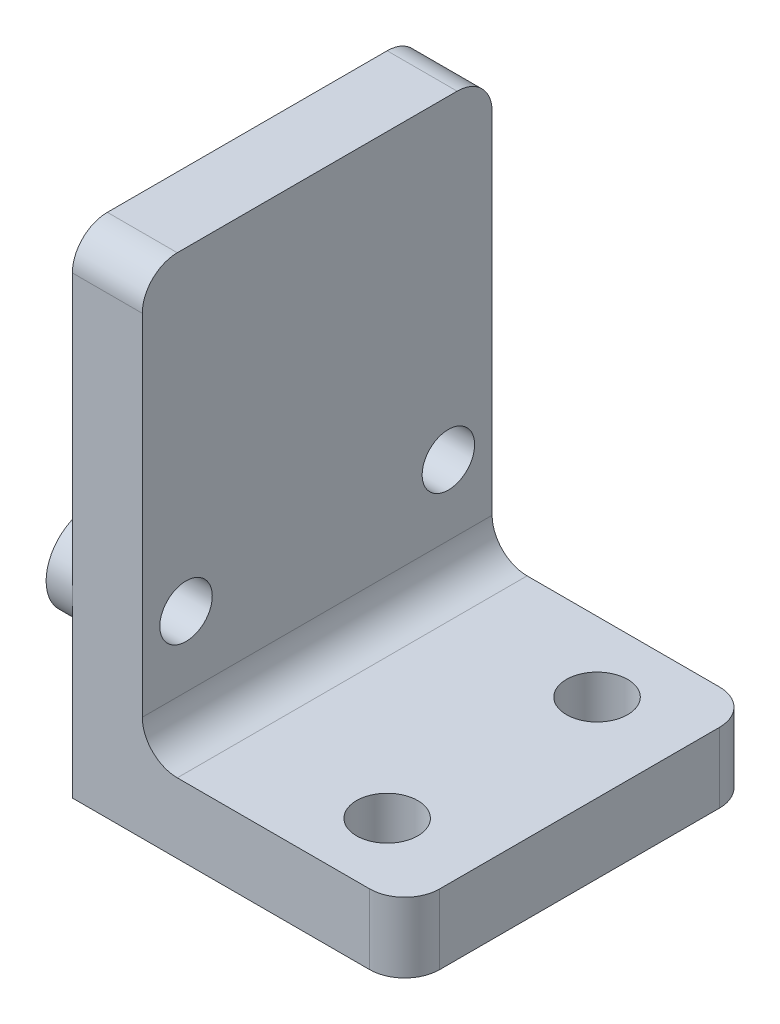
ISO-10303-21;
HEADER;
FILE_DESCRIPTION(('STEP AP214'),'2;1');
FILE_NAME('part.step','',(''),(''),'','','');
FILE_SCHEMA(('AUTOMOTIVE_DESIGN { 1 0 10303 214 1 1 1 1 }'));
ENDSEC;
DATA;
#1=APPLICATION_CONTEXT('core data for automotive mechanical design processes');
#2=APPLICATION_PROTOCOL_DEFINITION('international standard','automotive_design',2000,#1);
#3=PRODUCT_CONTEXT('',#1,'mechanical');
#4=PRODUCT('Part','Part','',(#3));
#5=PRODUCT_RELATED_PRODUCT_CATEGORY('part','',(#4));
#6=PRODUCT_DEFINITION_FORMATION('','',#4);
#7=PRODUCT_DEFINITION_CONTEXT('part definition',#1,'design');
#8=PRODUCT_DEFINITION('design','',#6,#7);
#9=PRODUCT_DEFINITION_SHAPE('','',#8);
#10=(LENGTH_UNIT() NAMED_UNIT(*) SI_UNIT(.MILLI.,.METRE.));
#11=(NAMED_UNIT(*) PLANE_ANGLE_UNIT() SI_UNIT($,.RADIAN.));
#12=(NAMED_UNIT(*) SI_UNIT($,.STERADIAN.) SOLID_ANGLE_UNIT());
#13=UNCERTAINTY_MEASURE_WITH_UNIT(LENGTH_MEASURE(1.E-05),#10,'distance_accuracy_value','');
#14=(GEOMETRIC_REPRESENTATION_CONTEXT(3) GLOBAL_UNCERTAINTY_ASSIGNED_CONTEXT((#13)) GLOBAL_UNIT_ASSIGNED_CONTEXT((#10,
#11,#12)) REPRESENTATION_CONTEXT('',''));
#15=CARTESIAN_POINT('',(0.,0.,0.));
#16=DIRECTION('',(0.,0.,1.));
#17=DIRECTION('',(1.,0.,0.));
#18=AXIS2_PLACEMENT_3D('',#15,#16,#17);
#19=CARTESIAN_POINT('',(0.,0.,20.));
#20=DIRECTION('',(1.,0.,0.));
#21=DIRECTION('',(0.,1.,0.));
#22=AXIS2_PLACEMENT_3D('',#19,#20,#21);
#23=PLANE('',#22);
#24=DIRECTION('',(0.,-1.,0.));
#25=VECTOR('',#24,1.);
#26=CARTESIAN_POINT('',(0.,0.,20.));
#27=LINE('',#26,#25);
#28=CARTESIAN_POINT('',(0.,10.,20.));
#29=VERTEX_POINT('',#28);
#30=CARTESIAN_POINT('',(0.,0.,20.));
#31=VERTEX_POINT('',#30);
#32=EDGE_CURVE('E134',#29,#31,#27,.T.);
#33=ORIENTED_EDGE('',*,*,#32,.F.);
#34=CARTESIAN_POINT('',(0.,10.,17.5));
#35=DIRECTION('',(-1.,0.,0.));
#36=DIRECTION('',(0.,-1.,0.));
#37=AXIS2_PLACEMENT_3D('',#34,#35,#36);
#38=CIRCLE('',#37,2.5);
#39=EDGE_CURVE('E143',#29,#29,#38,.T.);
#40=ORIENTED_EDGE('',*,*,#39,.F.);
#41=CARTESIAN_POINT('',(0.,26.,20.));
#42=VERTEX_POINT('',#41);
#43=EDGE_CURVE('E130',#42,#29,#27,.T.);
#44=ORIENTED_EDGE('',*,*,#43,.F.);
#45=CARTESIAN_POINT('',(0.,26.,18.));
#46=DIRECTION('',(1.,0.,0.));
#47=DIRECTION('',(0.,1.,0.));
#48=AXIS2_PLACEMENT_3D('',#45,#46,#47);
#49=CIRCLE('',#48,2.);
#50=CARTESIAN_POINT('',(0.,28.,18.));
#51=VERTEX_POINT('',#50);
#52=EDGE_CURVE('E64',#42,#51,#49,.F.);
#53=ORIENTED_EDGE('',*,*,#52,.T.);
#54=DIRECTION('',(0.,0.,-1.));
#55=VECTOR('',#54,1.);
#56=CARTESIAN_POINT('',(0.,28.,20.));
#57=LINE('',#56,#55);
#58=CARTESIAN_POINT('',(0.,28.,2.));
#59=VERTEX_POINT('',#58);
#60=EDGE_CURVE('E166',#51,#59,#57,.T.);
#61=ORIENTED_EDGE('',*,*,#60,.T.);
#62=CARTESIAN_POINT('',(0.,26.,2.));
#63=DIRECTION('',(1.,0.,0.));
#64=DIRECTION('',(0.,1.,0.));
#65=AXIS2_PLACEMENT_3D('',#62,#63,#64);
#66=CIRCLE('',#65,2.);
#67=CARTESIAN_POINT('',(0.,26.,0.));
#68=VERTEX_POINT('',#67);
#69=EDGE_CURVE('E56',#59,#68,#66,.F.);
#70=ORIENTED_EDGE('',*,*,#69,.T.);
#71=DIRECTION('',(0.,-1.,0.));
#72=VECTOR('',#71,1.);
#73=CARTESIAN_POINT('',(0.,0.,0.));
#74=LINE('',#73,#72);
#75=CARTESIAN_POINT('',(0.,10.,0.));
#76=VERTEX_POINT('',#75);
#77=EDGE_CURVE('E162',#68,#76,#74,.T.);
#78=ORIENTED_EDGE('',*,*,#77,.T.);
#79=CARTESIAN_POINT('',(0.,10.,2.5));
#80=DIRECTION('',(-1.,0.,0.));
#81=DIRECTION('',(0.,-1.,0.));
#82=AXIS2_PLACEMENT_3D('',#79,#80,#81);
#83=CIRCLE('',#82,2.5);
#84=EDGE_CURVE('E307',#76,#76,#83,.T.);
#85=ORIENTED_EDGE('',*,*,#84,.F.);
#86=CARTESIAN_POINT('',(0.,0.,0.));
#87=VERTEX_POINT('',#86);
#88=EDGE_CURVE('E161',#76,#87,#74,.T.);
#89=ORIENTED_EDGE('',*,*,#88,.T.);
#90=DIRECTION('',(0.,0.,-1.));
#91=VECTOR('',#90,1.);
#92=CARTESIAN_POINT('',(0.,0.,20.));
#93=LINE('',#92,#91);
#94=EDGE_CURVE('E140',#31,#87,#93,.T.);
#95=ORIENTED_EDGE('',*,*,#94,.F.);
#96=EDGE_LOOP('',(#33,#40,#44,#53,#61,#70,#78,#85,#89,#95));
#97=FACE_BOUND('',#96,.T.);
#98=ADVANCED_FACE('F41',(#97),#23,.F.);
#99=CARTESIAN_POINT('',(19.,0.,20.));
#100=DIRECTION('',(0.,1.,0.));
#101=DIRECTION('',(-1.,0.,0.));
#102=AXIS2_PLACEMENT_3D('',#99,#100,#101);
#103=PLANE('',#102);
#104=CARTESIAN_POINT('',(14.,0.,4.));
#105=DIRECTION('',(0.,1.,0.));
#106=DIRECTION('',(-1.,0.,0.));
#107=AXIS2_PLACEMENT_3D('',#104,#105,#106);
#108=CIRCLE('',#107,1.75);
#109=CARTESIAN_POINT('',(12.25,0.,4.));
#110=VERTEX_POINT('',#109);
#111=EDGE_CURVE('E294',#110,#110,#108,.T.);
#112=ORIENTED_EDGE('',*,*,#111,.T.);
#113=EDGE_LOOP('',(#112));
#114=FACE_BOUND('',#113,.T.);
#115=CARTESIAN_POINT('',(14.,0.,16.));
#116=DIRECTION('',(0.,1.,0.));
#117=DIRECTION('',(-1.,0.,0.));
#118=AXIS2_PLACEMENT_3D('',#115,#116,#117);
#119=CIRCLE('',#118,1.75);
#120=CARTESIAN_POINT('',(12.25,0.,16.));
#121=VERTEX_POINT('',#120);
#122=EDGE_CURVE('E295',#121,#121,#119,.T.);
#123=ORIENTED_EDGE('',*,*,#122,.T.);
#124=EDGE_LOOP('',(#123));
#125=FACE_BOUND('',#124,.T.);
#126=DIRECTION('',(1.,0.,0.));
#127=VECTOR('',#126,1.);
#128=CARTESIAN_POINT('',(19.,0.,0.));
#129=LINE('',#128,#127);
#130=CARTESIAN_POINT('',(17.,0.,0.));
#131=VERTEX_POINT('',#130);
#132=EDGE_CURVE('E151',#87,#131,#129,.T.);
#133=ORIENTED_EDGE('',*,*,#132,.T.);
#134=CARTESIAN_POINT('',(17.,0.,2.));
#135=DIRECTION('',(0.,1.,0.));
#136=DIRECTION('',(-1.,0.,0.));
#137=AXIS2_PLACEMENT_3D('',#134,#135,#136);
#138=CIRCLE('',#137,2.);
#139=CARTESIAN_POINT('',(19.,0.,2.));
#140=VERTEX_POINT('',#139);
#141=EDGE_CURVE('E194',#131,#140,#138,.F.);
#142=ORIENTED_EDGE('',*,*,#141,.T.);
#143=DIRECTION('',(0.,0.,-1.));
#144=VECTOR('',#143,1.);
#145=CARTESIAN_POINT('',(19.,0.,20.));
#146=LINE('',#145,#144);
#147=CARTESIAN_POINT('',(19.,0.,18.));
#148=VERTEX_POINT('',#147);
#149=EDGE_CURVE('E174',#148,#140,#146,.T.);
#150=ORIENTED_EDGE('',*,*,#149,.F.);
#151=CARTESIAN_POINT('',(17.,0.,18.));
#152=DIRECTION('',(0.,1.,0.));
#153=DIRECTION('',(-1.,0.,0.));
#154=AXIS2_PLACEMENT_3D('',#151,#152,#153);
#155=CIRCLE('',#154,2.);
#156=CARTESIAN_POINT('',(17.,0.,20.));
#157=VERTEX_POINT('',#156);
#158=EDGE_CURVE('E192',#148,#157,#155,.F.);
#159=ORIENTED_EDGE('',*,*,#158,.T.);
#160=DIRECTION('',(1.,0.,0.));
#161=VECTOR('',#160,1.);
#162=CARTESIAN_POINT('',(19.,0.,20.));
#163=LINE('',#162,#161);
#164=EDGE_CURVE('E164',#31,#157,#163,.T.);
#165=ORIENTED_EDGE('',*,*,#164,.F.);
#166=ORIENTED_EDGE('',*,*,#94,.T.);
#167=EDGE_LOOP('',(#133,#142,#150,#159,#165,#166));
#168=FACE_BOUND('',#167,.T.);
#169=ADVANCED_FACE('F250',(#114,#125,#168),#103,.F.);
#170=CARTESIAN_POINT('',(19.,4.,20.));
#171=DIRECTION('',(-1.,0.,0.));
#172=DIRECTION('',(0.,0.,1.));
#173=AXIS2_PLACEMENT_3D('',#170,#171,#172);
#174=PLANE('',#173);
#175=ORIENTED_EDGE('',*,*,#149,.T.);
#176=DIRECTION('',(0.,1.,0.));
#177=VECTOR('',#176,1.);
#178=CARTESIAN_POINT('',(19.,4.,2.));
#179=LINE('',#178,#177);
#180=CARTESIAN_POINT('',(19.,4.,2.));
#181=VERTEX_POINT('',#180);
#182=EDGE_CURVE('E179',#140,#181,#179,.T.);
#183=ORIENTED_EDGE('',*,*,#182,.T.);
#184=DIRECTION('',(0.,0.,-1.));
#185=VECTOR('',#184,1.);
#186=CARTESIAN_POINT('',(19.,4.,20.));
#187=LINE('',#186,#185);
#188=CARTESIAN_POINT('',(19.,4.,18.));
#189=VERTEX_POINT('',#188);
#190=EDGE_CURVE('E171',#189,#181,#187,.T.);
#191=ORIENTED_EDGE('',*,*,#190,.F.);
#192=DIRECTION('',(0.,1.,0.));
#193=VECTOR('',#192,1.);
#194=CARTESIAN_POINT('',(19.,4.,18.));
#195=LINE('',#194,#193);
#196=EDGE_CURVE('E177',#189,#148,#195,.F.);
#197=ORIENTED_EDGE('',*,*,#196,.T.);
#198=EDGE_LOOP('',(#175,#183,#191,#197));
#199=FACE_BOUND('',#198,.T.);
#200=ADVANCED_FACE('F256',(#199),#174,.F.);
#201=CARTESIAN_POINT('',(4.,4.,20.));
#202=DIRECTION('',(0.,-1.,0.));
#203=DIRECTION('',(1.,0.,0.));
#204=AXIS2_PLACEMENT_3D('',#201,#202,#203);
#205=PLANE('',#204);
#206=CARTESIAN_POINT('',(14.,4.,4.));
#207=DIRECTION('',(0.,1.,0.));
#208=DIRECTION('',(-1.,0.,0.));
#209=AXIS2_PLACEMENT_3D('',#206,#207,#208);
#210=CIRCLE('',#209,1.75);
#211=CARTESIAN_POINT('',(12.25,4.,4.));
#212=VERTEX_POINT('',#211);
#213=EDGE_CURVE('E302',#212,#212,#210,.T.);
#214=ORIENTED_EDGE('',*,*,#213,.F.);
#215=EDGE_LOOP('',(#214));
#216=FACE_BOUND('',#215,.T.);
#217=CARTESIAN_POINT('',(14.,4.,16.));
#218=DIRECTION('',(0.,1.,0.));
#219=DIRECTION('',(-1.,0.,0.));
#220=AXIS2_PLACEMENT_3D('',#217,#218,#219);
#221=CIRCLE('',#220,1.75);
#222=CARTESIAN_POINT('',(12.25,4.,16.));
#223=VERTEX_POINT('',#222);
#224=EDGE_CURVE('E298',#223,#223,#221,.T.);
#225=ORIENTED_EDGE('',*,*,#224,.F.);
#226=EDGE_LOOP('',(#225));
#227=FACE_BOUND('',#226,.T.);
#228=ORIENTED_EDGE('',*,*,#190,.T.);
#229=CARTESIAN_POINT('',(17.,4.,2.));
#230=DIRECTION('',(0.,-1.,0.));
#231=DIRECTION('',(1.,0.,0.));
#232=AXIS2_PLACEMENT_3D('',#229,#230,#231);
#233=CIRCLE('',#232,2.);
#234=CARTESIAN_POINT('',(17.,4.,0.));
#235=VERTEX_POINT('',#234);
#236=EDGE_CURVE('E186',#181,#235,#233,.F.);
#237=ORIENTED_EDGE('',*,*,#236,.T.);
#238=DIRECTION('',(-1.,0.,0.));
#239=VECTOR('',#238,1.);
#240=CARTESIAN_POINT('',(4.,4.,0.));
#241=LINE('',#240,#239);
#242=CARTESIAN_POINT('',(6.,4.,0.));
#243=VERTEX_POINT('',#242);
#244=EDGE_CURVE('E154',#235,#243,#241,.T.);
#245=ORIENTED_EDGE('',*,*,#244,.T.);
#246=DIRECTION('',(0.,0.,-1.));
#247=VECTOR('',#246,1.);
#248=CARTESIAN_POINT('',(6.,4.,20.));
#249=LINE('',#248,#247);
#250=CARTESIAN_POINT('',(6.,4.,20.));
#251=VERTEX_POINT('',#250);
#252=EDGE_CURVE('E182',#243,#251,#249,.F.);
#253=ORIENTED_EDGE('',*,*,#252,.T.);
#254=DIRECTION('',(-1.,0.,0.));
#255=VECTOR('',#254,1.);
#256=CARTESIAN_POINT('',(4.,4.,20.));
#257=LINE('',#256,#255);
#258=CARTESIAN_POINT('',(17.,4.,20.));
#259=VERTEX_POINT('',#258);
#260=EDGE_CURVE('E147',#259,#251,#257,.T.);
#261=ORIENTED_EDGE('',*,*,#260,.F.);
#262=CARTESIAN_POINT('',(17.,4.,18.));
#263=DIRECTION('',(0.,-1.,0.));
#264=DIRECTION('',(1.,0.,0.));
#265=AXIS2_PLACEMENT_3D('',#262,#263,#264);
#266=CIRCLE('',#265,2.);
#267=EDGE_CURVE('E184',#259,#189,#266,.F.);
#268=ORIENTED_EDGE('',*,*,#267,.T.);
#269=EDGE_LOOP('',(#228,#237,#245,#253,#261,#268));
#270=FACE_BOUND('',#269,.T.);
#271=ADVANCED_FACE('F221',(#216,#227,#270),#205,.F.);
#272=CARTESIAN_POINT('',(3.99999999999999,28.,20.));
#273=DIRECTION('',(-1.,0.,0.));
#274=DIRECTION('',(0.,-1.,0.));
#275=AXIS2_PLACEMENT_3D('',#272,#273,#274);
#276=PLANE('',#275);
#277=CARTESIAN_POINT('',(4.,10.,17.5));
#278=DIRECTION('',(-1.,0.,0.));
#279=DIRECTION('',(0.,-1.,0.));
#280=AXIS2_PLACEMENT_3D('',#277,#278,#279);
#281=CIRCLE('',#280,1.5);
#282=CARTESIAN_POINT('',(4.,8.5,17.5));
#283=VERTEX_POINT('',#282);
#284=EDGE_CURVE('E155',#283,#283,#281,.T.);
#285=ORIENTED_EDGE('',*,*,#284,.T.);
#286=EDGE_LOOP('',(#285));
#287=FACE_BOUND('',#286,.T.);
#288=CARTESIAN_POINT('',(4.,10.,2.5));
#289=DIRECTION('',(-1.,0.,0.));
#290=DIRECTION('',(0.,-1.,0.));
#291=AXIS2_PLACEMENT_3D('',#288,#289,#290);
#292=CIRCLE('',#291,1.5);
#293=CARTESIAN_POINT('',(4.,8.5,2.5));
#294=VERTEX_POINT('',#293);
#295=EDGE_CURVE('E291',#294,#294,#292,.T.);
#296=ORIENTED_EDGE('',*,*,#295,.T.);
#297=EDGE_LOOP('',(#296));
#298=FACE_BOUND('',#297,.T.);
#299=DIRECTION('',(0.,1.,0.));
#300=VECTOR('',#299,1.);
#301=CARTESIAN_POINT('',(3.99999999999999,28.,20.));
#302=LINE('',#301,#300);
#303=CARTESIAN_POINT('',(4.,6.00000000000001,20.));
#304=VERTEX_POINT('',#303);
#305=CARTESIAN_POINT('',(4.,26.,20.));
#306=VERTEX_POINT('',#305);
#307=EDGE_CURVE('E146',#304,#306,#302,.T.);
#308=ORIENTED_EDGE('',*,*,#307,.F.);
#309=DIRECTION('',(0.,0.,-1.));
#310=VECTOR('',#309,1.);
#311=CARTESIAN_POINT('',(4.,6.,0.));
#312=LINE('',#311,#310);
#313=CARTESIAN_POINT('',(4.,6.00000000000001,0.));
#314=VERTEX_POINT('',#313);
#315=EDGE_CURVE('E204',#304,#314,#312,.T.);
#316=ORIENTED_EDGE('',*,*,#315,.T.);
#317=DIRECTION('',(0.,1.,0.));
#318=VECTOR('',#317,1.);
#319=CARTESIAN_POINT('',(3.99999999999999,28.,0.));
#320=LINE('',#319,#318);
#321=CARTESIAN_POINT('',(4.,26.,0.));
#322=VERTEX_POINT('',#321);
#323=EDGE_CURVE('E158',#314,#322,#320,.T.);
#324=ORIENTED_EDGE('',*,*,#323,.T.);
#325=CARTESIAN_POINT('',(4.,26.,2.));
#326=DIRECTION('',(-1.,0.,0.));
#327=DIRECTION('',(0.,-1.,0.));
#328=AXIS2_PLACEMENT_3D('',#325,#326,#327);
#329=CIRCLE('',#328,2.);
#330=CARTESIAN_POINT('',(3.99999999999999,28.,2.));
#331=VERTEX_POINT('',#330);
#332=EDGE_CURVE('E202',#322,#331,#329,.F.);
#333=ORIENTED_EDGE('',*,*,#332,.T.);
#334=DIRECTION('',(0.,0.,-1.));
#335=VECTOR('',#334,1.);
#336=CARTESIAN_POINT('',(3.99999999999999,28.,20.));
#337=LINE('',#336,#335);
#338=CARTESIAN_POINT('',(3.99999999999999,28.,18.));
#339=VERTEX_POINT('',#338);
#340=EDGE_CURVE('E168',#339,#331,#337,.T.);
#341=ORIENTED_EDGE('',*,*,#340,.F.);
#342=CARTESIAN_POINT('',(4.,26.,18.));
#343=DIRECTION('',(-1.,0.,0.));
#344=DIRECTION('',(0.,-1.,0.));
#345=AXIS2_PLACEMENT_3D('',#342,#343,#344);
#346=CIRCLE('',#345,2.);
#347=EDGE_CURVE('E200',#339,#306,#346,.F.);
#348=ORIENTED_EDGE('',*,*,#347,.T.);
#349=EDGE_LOOP('',(#308,#316,#324,#333,#341,#348));
#350=FACE_BOUND('',#349,.T.);
#351=ADVANCED_FACE('F228',(#287,#298,#350),#276,.F.);
#352=CARTESIAN_POINT('',(0.,28.,20.));
#353=DIRECTION('',(0.,-1.,0.));
#354=DIRECTION('',(0.,0.,-1.));
#355=AXIS2_PLACEMENT_3D('',#352,#353,#354);
#356=PLANE('',#355);
#357=ORIENTED_EDGE('',*,*,#340,.T.);
#358=DIRECTION('',(-1.,0.,0.));
#359=VECTOR('',#358,1.);
#360=CARTESIAN_POINT('',(0.,28.,2.));
#361=LINE('',#360,#359);
#362=EDGE_CURVE('E209',#331,#59,#361,.T.);
#363=ORIENTED_EDGE('',*,*,#362,.T.);
#364=ORIENTED_EDGE('',*,*,#60,.F.);
#365=DIRECTION('',(-1.,0.,0.));
#366=VECTOR('',#365,1.);
#367=CARTESIAN_POINT('',(0.,28.,18.));
#368=LINE('',#367,#366);
#369=EDGE_CURVE('E207',#51,#339,#368,.F.);
#370=ORIENTED_EDGE('',*,*,#369,.T.);
#371=EDGE_LOOP('',(#357,#363,#364,#370));
#372=FACE_BOUND('',#371,.T.);
#373=ADVANCED_FACE('F234',(#372),#356,.F.);
#374=CARTESIAN_POINT('',(0.,0.,20.));
#375=DIRECTION('',(0.,0.,-1.));
#376=DIRECTION('',(-1.,0.,0.));
#377=AXIS2_PLACEMENT_3D('',#374,#375,#376);
#378=PLANE('',#377);
#379=ORIENTED_EDGE('',*,*,#164,.T.);
#380=DIRECTION('',(0.,1.,0.));
#381=VECTOR('',#380,1.);
#382=CARTESIAN_POINT('',(17.,0.,20.));
#383=LINE('',#382,#381);
#384=EDGE_CURVE('E197',#157,#259,#383,.T.);
#385=ORIENTED_EDGE('',*,*,#384,.T.);
#386=ORIENTED_EDGE('',*,*,#260,.T.);
#387=CARTESIAN_POINT('',(6.,6.,20.));
#388=DIRECTION('',(0.,0.,-1.));
#389=DIRECTION('',(-1.,0.,0.));
#390=AXIS2_PLACEMENT_3D('',#387,#388,#389);
#391=CIRCLE('',#390,2.);
#392=EDGE_CURVE('E11',#251,#304,#391,.T.);
#393=ORIENTED_EDGE('',*,*,#392,.T.);
#394=ORIENTED_EDGE('',*,*,#307,.T.);
#395=DIRECTION('',(-1.,0.,0.));
#396=VECTOR('',#395,1.);
#397=CARTESIAN_POINT('',(0.,26.,20.));
#398=LINE('',#397,#396);
#399=EDGE_CURVE('E138',#306,#42,#398,.T.);
#400=ORIENTED_EDGE('',*,*,#399,.T.);
#401=ORIENTED_EDGE('',*,*,#43,.T.);
#402=ORIENTED_EDGE('',*,*,#32,.T.);
#403=EDGE_LOOP('',(#379,#385,#386,#393,#394,#400,#401,#402));
#404=FACE_BOUND('',#403,.T.);
#405=ADVANCED_FACE('F133',(#404),#378,.F.);
#406=CARTESIAN_POINT('',(0.,0.,0.));
#407=DIRECTION('',(0.,0.,-1.));
#408=DIRECTION('',(-1.,0.,0.));
#409=AXIS2_PLACEMENT_3D('',#406,#407,#408);
#410=PLANE('',#409);
#411=ORIENTED_EDGE('',*,*,#244,.F.);
#412=DIRECTION('',(0.,1.,0.));
#413=VECTOR('',#412,1.);
#414=CARTESIAN_POINT('',(17.,0.,0.));
#415=LINE('',#414,#413);
#416=EDGE_CURVE('E190',#235,#131,#415,.F.);
#417=ORIENTED_EDGE('',*,*,#416,.T.);
#418=ORIENTED_EDGE('',*,*,#132,.F.);
#419=ORIENTED_EDGE('',*,*,#88,.F.);
#420=ORIENTED_EDGE('',*,*,#77,.F.);
#421=DIRECTION('',(-1.,0.,0.));
#422=VECTOR('',#421,1.);
#423=CARTESIAN_POINT('',(3.99999999999999,26.,0.));
#424=LINE('',#423,#422);
#425=EDGE_CURVE('E188',#68,#322,#424,.F.);
#426=ORIENTED_EDGE('',*,*,#425,.T.);
#427=ORIENTED_EDGE('',*,*,#323,.F.);
#428=CARTESIAN_POINT('',(6.,6.,0.));
#429=DIRECTION('',(0.,0.,-1.));
#430=DIRECTION('',(-1.,0.,0.));
#431=AXIS2_PLACEMENT_3D('',#428,#429,#430);
#432=CIRCLE('',#431,2.);
#433=EDGE_CURVE('E49',#314,#243,#432,.F.);
#434=ORIENTED_EDGE('',*,*,#433,.T.);
#435=EDGE_LOOP('',(#411,#417,#418,#419,#420,#426,#427,#434));
#436=FACE_BOUND('',#435,.T.);
#437=ADVANCED_FACE('F215',(#436),#410,.T.);
#438=CARTESIAN_POINT('',(19.,10.,2.5));
#439=DIRECTION('',(-1.,0.,0.));
#440=DIRECTION('',(0.,-1.,0.));
#441=AXIS2_PLACEMENT_3D('',#438,#439,#440);
#442=CYLINDRICAL_SURFACE('',#441,1.5);
#443=ORIENTED_EDGE('',*,*,#295,.F.);
#444=EDGE_LOOP('',(#443));
#445=FACE_BOUND('',#444,.T.);
#446=CARTESIAN_POINT('',(-1.5,10.,2.5));
#447=DIRECTION('',(-1.,0.,0.));
#448=DIRECTION('',(0.,-1.,0.));
#449=AXIS2_PLACEMENT_3D('',#446,#447,#448);
#450=CIRCLE('',#449,1.5);
#451=CARTESIAN_POINT('',(-1.5,8.5,2.5));
#452=VERTEX_POINT('',#451);
#453=EDGE_CURVE('E310',#452,#452,#450,.T.);
#454=ORIENTED_EDGE('',*,*,#453,.T.);
#455=EDGE_LOOP('',(#454));
#456=FACE_BOUND('',#455,.T.);
#457=ADVANCED_FACE('F351',(#445,#456),#442,.F.);
#458=CARTESIAN_POINT('',(19.,10.,17.5));
#459=DIRECTION('',(-1.,0.,0.));
#460=DIRECTION('',(0.,-1.,0.));
#461=AXIS2_PLACEMENT_3D('',#458,#459,#460);
#462=CYLINDRICAL_SURFACE('',#461,1.5);
#463=ORIENTED_EDGE('',*,*,#284,.F.);
#464=EDGE_LOOP('',(#463));
#465=FACE_BOUND('',#464,.T.);
#466=CARTESIAN_POINT('',(-1.5,10.,17.5));
#467=DIRECTION('',(-1.,0.,0.));
#468=DIRECTION('',(0.,-1.,0.));
#469=AXIS2_PLACEMENT_3D('',#466,#467,#468);
#470=CIRCLE('',#469,1.5);
#471=CARTESIAN_POINT('',(-1.5,8.5,17.5));
#472=VERTEX_POINT('',#471);
#473=EDGE_CURVE('E315',#472,#472,#470,.T.);
#474=ORIENTED_EDGE('',*,*,#473,.T.);
#475=EDGE_LOOP('',(#474));
#476=FACE_BOUND('',#475,.T.);
#477=ADVANCED_FACE('F347',(#465,#476),#462,.F.);
#478=CARTESIAN_POINT('',(14.,0.,16.));
#479=DIRECTION('',(0.,1.,0.));
#480=DIRECTION('',(-1.,0.,0.));
#481=AXIS2_PLACEMENT_3D('',#478,#479,#480);
#482=CYLINDRICAL_SURFACE('',#481,1.75);
#483=ORIENTED_EDGE('',*,*,#122,.F.);
#484=EDGE_LOOP('',(#483));
#485=FACE_BOUND('',#484,.T.);
#486=ORIENTED_EDGE('',*,*,#224,.T.);
#487=EDGE_LOOP('',(#486));
#488=FACE_BOUND('',#487,.T.);
#489=ADVANCED_FACE('F343',(#485,#488),#482,.F.);
#490=CARTESIAN_POINT('',(14.,0.,4.));
#491=DIRECTION('',(0.,1.,0.));
#492=DIRECTION('',(-1.,0.,0.));
#493=AXIS2_PLACEMENT_3D('',#490,#491,#492);
#494=CYLINDRICAL_SURFACE('',#493,1.75);
#495=ORIENTED_EDGE('',*,*,#111,.F.);
#496=EDGE_LOOP('',(#495));
#497=FACE_BOUND('',#496,.T.);
#498=ORIENTED_EDGE('',*,*,#213,.T.);
#499=EDGE_LOOP('',(#498));
#500=FACE_BOUND('',#499,.T.);
#501=ADVANCED_FACE('F276',(#497,#500),#494,.F.);
#502=CARTESIAN_POINT('',(17.,4.,2.));
#503=DIRECTION('',(0.,-1.,0.));
#504=DIRECTION('',(0.,0.,-1.));
#505=AXIS2_PLACEMENT_3D('',#502,#503,#504);
#506=CYLINDRICAL_SURFACE('',#505,2.);
#507=ORIENTED_EDGE('',*,*,#141,.F.);
#508=ORIENTED_EDGE('',*,*,#416,.F.);
#509=ORIENTED_EDGE('',*,*,#236,.F.);
#510=ORIENTED_EDGE('',*,*,#182,.F.);
#511=EDGE_LOOP('',(#507,#508,#509,#510));
#512=FACE_BOUND('',#511,.T.);
#513=ADVANCED_FACE('F273',(#512),#506,.T.);
#514=CARTESIAN_POINT('',(17.,0.,18.));
#515=DIRECTION('',(0.,1.,0.));
#516=DIRECTION('',(0.,0.,1.));
#517=AXIS2_PLACEMENT_3D('',#514,#515,#516);
#518=CYLINDRICAL_SURFACE('',#517,2.);
#519=ORIENTED_EDGE('',*,*,#158,.F.);
#520=ORIENTED_EDGE('',*,*,#196,.F.);
#521=ORIENTED_EDGE('',*,*,#267,.F.);
#522=ORIENTED_EDGE('',*,*,#384,.F.);
#523=EDGE_LOOP('',(#519,#520,#521,#522));
#524=FACE_BOUND('',#523,.T.);
#525=ADVANCED_FACE('F247',(#524),#518,.T.);
#526=CARTESIAN_POINT('',(6.,6.,20.));
#527=DIRECTION('',(0.,0.,1.));
#528=DIRECTION('',(1.,0.,0.));
#529=AXIS2_PLACEMENT_3D('',#526,#527,#528);
#530=CYLINDRICAL_SURFACE('',#529,2.);
#531=ORIENTED_EDGE('',*,*,#392,.F.);
#532=ORIENTED_EDGE('',*,*,#252,.F.);
#533=ORIENTED_EDGE('',*,*,#433,.F.);
#534=ORIENTED_EDGE('',*,*,#315,.F.);
#535=EDGE_LOOP('',(#531,#532,#533,#534));
#536=FACE_BOUND('',#535,.T.);
#537=ADVANCED_FACE('F225',(#536),#530,.F.);
#538=CARTESIAN_POINT('',(0.,26.,2.));
#539=DIRECTION('',(1.,0.,0.));
#540=DIRECTION('',(0.,0.,-1.));
#541=AXIS2_PLACEMENT_3D('',#538,#539,#540);
#542=CYLINDRICAL_SURFACE('',#541,2.);
#543=ORIENTED_EDGE('',*,*,#332,.F.);
#544=ORIENTED_EDGE('',*,*,#425,.F.);
#545=ORIENTED_EDGE('',*,*,#69,.F.);
#546=ORIENTED_EDGE('',*,*,#362,.F.);
#547=EDGE_LOOP('',(#543,#544,#545,#546));
#548=FACE_BOUND('',#547,.T.);
#549=ADVANCED_FACE('F240',(#548),#542,.T.);
#550=CARTESIAN_POINT('',(0.,26.,18.));
#551=DIRECTION('',(-1.,0.,0.));
#552=DIRECTION('',(0.,0.,1.));
#553=AXIS2_PLACEMENT_3D('',#550,#551,#552);
#554=CYLINDRICAL_SURFACE('',#553,2.);
#555=ORIENTED_EDGE('',*,*,#347,.F.);
#556=ORIENTED_EDGE('',*,*,#369,.F.);
#557=ORIENTED_EDGE('',*,*,#52,.F.);
#558=ORIENTED_EDGE('',*,*,#399,.F.);
#559=EDGE_LOOP('',(#555,#556,#557,#558));
#560=FACE_BOUND('',#559,.T.);
#561=ADVANCED_FACE('F43',(#560),#554,.T.);
#562=CARTESIAN_POINT('',(-1.5,10.,2.5));
#563=DIRECTION('',(-1.,0.,0.));
#564=DIRECTION('',(0.,-1.,0.));
#565=AXIS2_PLACEMENT_3D('',#562,#563,#564);
#566=PLANE('',#565);
#567=CARTESIAN_POINT('',(-1.5,10.,2.5));
#568=DIRECTION('',(-1.,0.,0.));
#569=DIRECTION('',(0.,-1.,0.));
#570=AXIS2_PLACEMENT_3D('',#567,#568,#569);
#571=CIRCLE('',#570,2.5);
#572=CARTESIAN_POINT('',(-1.5,7.5,2.5));
#573=VERTEX_POINT('',#572);
#574=EDGE_CURVE('E299',#573,#573,#571,.T.);
#575=ORIENTED_EDGE('',*,*,#574,.T.);
#576=EDGE_LOOP('',(#575));
#577=FACE_BOUND('',#576,.T.);
#578=ORIENTED_EDGE('',*,*,#453,.F.);
#579=EDGE_LOOP('',(#578));
#580=FACE_BOUND('',#579,.T.);
#581=ADVANCED_FACE('F246',(#577,#580),#566,.T.);
#582=CARTESIAN_POINT('',(-1.5,10.,2.5));
#583=DIRECTION('',(1.,0.,0.));
#584=DIRECTION('',(0.,1.,0.));
#585=AXIS2_PLACEMENT_3D('',#582,#583,#584);
#586=CYLINDRICAL_SURFACE('',#585,2.5);
#587=ORIENTED_EDGE('',*,*,#574,.F.);
#588=EDGE_LOOP('',(#587));
#589=FACE_BOUND('',#588,.T.);
#590=ORIENTED_EDGE('',*,*,#84,.T.);
#591=EDGE_LOOP('',(#590));
#592=FACE_BOUND('',#591,.T.);
#593=ADVANCED_FACE('F330',(#589,#592),#586,.T.);
#594=CARTESIAN_POINT('',(-1.5,10.,17.5));
#595=DIRECTION('',(-1.,0.,0.));
#596=DIRECTION('',(0.,-1.,0.));
#597=AXIS2_PLACEMENT_3D('',#594,#595,#596);
#598=PLANE('',#597);
#599=CARTESIAN_POINT('',(-1.5,10.,17.5));
#600=DIRECTION('',(-1.,0.,0.));
#601=DIRECTION('',(0.,-1.,0.));
#602=AXIS2_PLACEMENT_3D('',#599,#600,#601);
#603=CIRCLE('',#602,2.5);
#604=CARTESIAN_POINT('',(-1.5,7.50000000000001,17.5));
#605=VERTEX_POINT('',#604);
#606=EDGE_CURVE('E318',#605,#605,#603,.T.);
#607=ORIENTED_EDGE('',*,*,#606,.T.);
#608=EDGE_LOOP('',(#607));
#609=FACE_BOUND('',#608,.T.);
#610=ORIENTED_EDGE('',*,*,#473,.F.);
#611=EDGE_LOOP('',(#610));
#612=FACE_BOUND('',#611,.T.);
#613=ADVANCED_FACE('F324',(#609,#612),#598,.T.);
#614=CARTESIAN_POINT('',(-1.5,10.,17.5));
#615=DIRECTION('',(1.,0.,0.));
#616=DIRECTION('',(0.,1.,0.));
#617=AXIS2_PLACEMENT_3D('',#614,#615,#616);
#618=CYLINDRICAL_SURFACE('',#617,2.5);
#619=ORIENTED_EDGE('',*,*,#606,.F.);
#620=EDGE_LOOP('',(#619));
#621=FACE_BOUND('',#620,.T.);
#622=ORIENTED_EDGE('',*,*,#39,.T.);
#623=EDGE_LOOP('',(#622));
#624=FACE_BOUND('',#623,.T.);
#625=ADVANCED_FACE('F322',(#621,#624),#618,.T.);
#626=CLOSED_SHELL('',(#98,#169,#200,#271,#351,#373,#405,#437,#457,#477,#489,#501,#513,#525,#537,
#549,#561,#581,#593,#613,#625));
#627=MANIFOLD_SOLID_BREP('B2',#626);
#628=ADVANCED_BREP_SHAPE_REPRESENTATION('',(#18,#627),#14);
#629=SHAPE_DEFINITION_REPRESENTATION(#9,#628);
ENDSEC;
END-ISO-10303-21;
